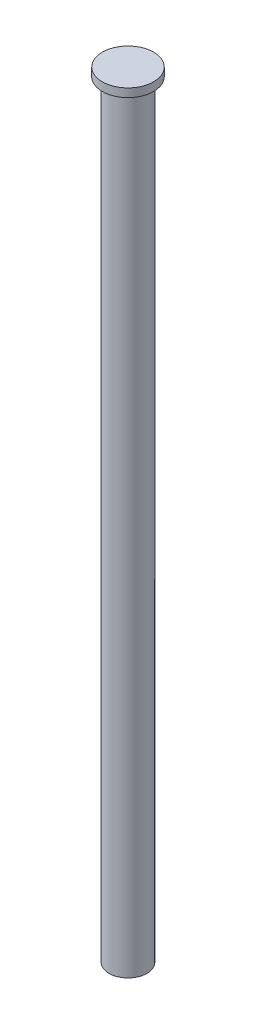
ISO-10303-21;
HEADER;
FILE_DESCRIPTION(('STEP AP214'),'2;1');
FILE_NAME('part.step','',(''),(''),'','','');
FILE_SCHEMA(('AUTOMOTIVE_DESIGN { 1 0 10303 214 1 1 1 1 }'));
ENDSEC;
DATA;
#1=APPLICATION_CONTEXT('core data for automotive mechanical design processes');
#2=APPLICATION_PROTOCOL_DEFINITION('international standard','automotive_design',2000,#1);
#3=PRODUCT_CONTEXT('',#1,'mechanical');
#4=PRODUCT('Part','Part','',(#3));
#5=PRODUCT_RELATED_PRODUCT_CATEGORY('part','',(#4));
#6=PRODUCT_DEFINITION_FORMATION('','',#4);
#7=PRODUCT_DEFINITION_CONTEXT('part definition',#1,'design');
#8=PRODUCT_DEFINITION('design','',#6,#7);
#9=PRODUCT_DEFINITION_SHAPE('','',#8);
#10=(LENGTH_UNIT() NAMED_UNIT(*) SI_UNIT(.MILLI.,.METRE.));
#11=(NAMED_UNIT(*) PLANE_ANGLE_UNIT() SI_UNIT($,.RADIAN.));
#12=(NAMED_UNIT(*) SI_UNIT($,.STERADIAN.) SOLID_ANGLE_UNIT());
#13=UNCERTAINTY_MEASURE_WITH_UNIT(LENGTH_MEASURE(1.E-05),#10,'distance_accuracy_value','');
#14=(GEOMETRIC_REPRESENTATION_CONTEXT(3) GLOBAL_UNCERTAINTY_ASSIGNED_CONTEXT((#13)) GLOBAL_UNIT_ASSIGNED_CONTEXT((#10,
#11,#12)) REPRESENTATION_CONTEXT('',''));
#15=CARTESIAN_POINT('',(0.,0.,0.));
#16=DIRECTION('',(0.,0.,1.));
#17=DIRECTION('',(1.,0.,0.));
#18=AXIS2_PLACEMENT_3D('',#15,#16,#17);
#19=CARTESIAN_POINT('',(0.,910.,0.));
#20=DIRECTION('',(0.,-1.,0.));
#21=DIRECTION('',(0.,0.,-1.));
#22=AXIS2_PLACEMENT_3D('',#19,#20,#21);
#23=CYLINDRICAL_SURFACE('',#22,22.5);
#24=CARTESIAN_POINT('',(0.,910.,0.));
#25=DIRECTION('',(0.,1.,0.));
#26=DIRECTION('',(0.,0.,1.));
#27=AXIS2_PLACEMENT_3D('',#24,#25,#26);
#28=CIRCLE('',#27,22.5);
#29=CARTESIAN_POINT('',(0.,910.,-22.5));
#30=VERTEX_POINT('',#29);
#31=EDGE_CURVE('E10',#30,#30,#28,.T.);
#32=CARTESIAN_POINT('',(0.,0.,0.));
#33=DIRECTION('',(0.,1.,0.));
#34=DIRECTION('',(0.,0.,1.));
#35=AXIS2_PLACEMENT_3D('',#32,#33,#34);
#36=CIRCLE('',#35,22.5);
#37=CARTESIAN_POINT('',(0.,0.,-22.5));
#38=VERTEX_POINT('',#37);
#39=EDGE_CURVE('E40',#38,#38,#36,.T.);
#40=CARTESIAN_POINT('',(0.,910.,-22.5));
#41=CARTESIAN_POINT('',(0.,900.520833333333,-22.5));
#42=CARTESIAN_POINT('',(0.,891.041666666667,-22.5));
#43=CARTESIAN_POINT('',(0.,872.083333333333,-22.5));
#44=CARTESIAN_POINT('',(0.,862.604166666667,-22.5));
#45=CARTESIAN_POINT('',(0.,843.645833333333,-22.5));
#46=CARTESIAN_POINT('',(0.,834.166666666667,-22.5));
#47=CARTESIAN_POINT('',(0.,815.208333333333,-22.5));
#48=CARTESIAN_POINT('',(0.,805.729166666667,-22.5));
#49=CARTESIAN_POINT('',(0.,786.770833333333,-22.5));
#50=CARTESIAN_POINT('',(0.,777.291666666667,-22.5));
#51=CARTESIAN_POINT('',(0.,758.333333333333,-22.5));
#52=CARTESIAN_POINT('',(0.,748.854166666667,-22.5));
#53=CARTESIAN_POINT('',(0.,729.895833333333,-22.5));
#54=CARTESIAN_POINT('',(0.,720.416666666667,-22.5));
#55=CARTESIAN_POINT('',(0.,701.458333333333,-22.5));
#56=CARTESIAN_POINT('',(0.,691.979166666667,-22.5));
#57=CARTESIAN_POINT('',(0.,673.020833333333,-22.5));
#58=CARTESIAN_POINT('',(0.,663.541666666667,-22.5));
#59=CARTESIAN_POINT('',(0.,644.583333333333,-22.5));
#60=CARTESIAN_POINT('',(0.,635.104166666667,-22.5));
#61=CARTESIAN_POINT('',(0.,616.145833333333,-22.5));
#62=CARTESIAN_POINT('',(0.,606.666666666667,-22.5));
#63=CARTESIAN_POINT('',(0.,587.708333333333,-22.5));
#64=CARTESIAN_POINT('',(0.,578.229166666667,-22.5));
#65=CARTESIAN_POINT('',(0.,559.270833333333,-22.5));
#66=CARTESIAN_POINT('',(0.,549.791666666667,-22.5));
#67=CARTESIAN_POINT('',(0.,530.833333333333,-22.5));
#68=CARTESIAN_POINT('',(0.,521.354166666667,-22.5));
#69=CARTESIAN_POINT('',(0.,502.395833333333,-22.5));
#70=CARTESIAN_POINT('',(0.,492.916666666667,-22.5));
#71=CARTESIAN_POINT('',(0.,473.958333333333,-22.5));
#72=CARTESIAN_POINT('',(0.,464.479166666667,-22.5));
#73=CARTESIAN_POINT('',(0.,445.520833333333,-22.5));
#74=CARTESIAN_POINT('',(0.,436.041666666667,-22.5));
#75=CARTESIAN_POINT('',(0.,417.083333333333,-22.5));
#76=CARTESIAN_POINT('',(0.,407.604166666667,-22.5));
#77=CARTESIAN_POINT('',(0.,388.645833333333,-22.5));
#78=CARTESIAN_POINT('',(0.,379.166666666667,-22.5));
#79=CARTESIAN_POINT('',(0.,360.208333333333,-22.5));
#80=CARTESIAN_POINT('',(0.,350.729166666667,-22.5));
#81=CARTESIAN_POINT('',(0.,331.770833333333,-22.5));
#82=CARTESIAN_POINT('',(0.,322.291666666667,-22.5));
#83=CARTESIAN_POINT('',(0.,303.333333333333,-22.5));
#84=CARTESIAN_POINT('',(0.,293.854166666667,-22.5));
#85=CARTESIAN_POINT('',(0.,274.895833333333,-22.5));
#86=CARTESIAN_POINT('',(0.,265.416666666667,-22.5));
#87=CARTESIAN_POINT('',(0.,246.458333333333,-22.5));
#88=CARTESIAN_POINT('',(0.,236.979166666667,-22.5));
#89=CARTESIAN_POINT('',(0.,218.020833333333,-22.5));
#90=CARTESIAN_POINT('',(0.,208.541666666667,-22.5));
#91=CARTESIAN_POINT('',(0.,189.583333333333,-22.5));
#92=CARTESIAN_POINT('',(0.,180.104166666667,-22.5));
#93=CARTESIAN_POINT('',(0.,161.145833333333,-22.5));
#94=CARTESIAN_POINT('',(0.,151.666666666667,-22.5));
#95=CARTESIAN_POINT('',(0.,132.708333333333,-22.5));
#96=CARTESIAN_POINT('',(0.,123.229166666667,-22.5));
#97=CARTESIAN_POINT('',(0.,104.270833333333,-22.5));
#98=CARTESIAN_POINT('',(0.,94.7916666666667,-22.5));
#99=CARTESIAN_POINT('',(0.,75.8333333333333,-22.5));
#100=CARTESIAN_POINT('',(0.,66.3541666666667,-22.5));
#101=CARTESIAN_POINT('',(0.,47.3958333333333,-22.5));
#102=CARTESIAN_POINT('',(0.,37.9166666666667,-22.5));
#103=CARTESIAN_POINT('',(0.,18.9583333333333,-22.5));
#104=CARTESIAN_POINT('',(0.,9.47916666666667,-22.5));
#105=CARTESIAN_POINT('',(0.,0.,-22.5));
#106=B_SPLINE_CURVE_WITH_KNOTS('',3,(#40,#41,#42,#43,#44,#45,#46,#47,#48,#49,#50,#51,#52,#53,
#54,#55,#56,#57,#58,#59,#60,#61,#62,#63,#64,#65,#66,#67,#68,#69,#70,#71,#72,#73,#74,#75,#76,#77,
#78,#79,#80,#81,#82,#83,#84,#85,#86,#87,#88,#89,#90,#91,#92,#93,#94,#95,#96,#97,#98,#99,#100,
#101,#102,#103,#104,#105),.UNSPECIFIED.,.F.,.F.,(4,2,2,2,2,2,2,2,2,2,2,2,2,2,2,2,2,2,2,2,2,2,2,
2,2,2,2,2,2,2,2,2,4),(0.,28.4375,56.875,85.3125,113.75,142.1875,170.625,199.0625,227.5,255.9375,
284.375,312.8125,341.25,369.6875,398.125,426.5625,455.,483.4375,511.875,540.3125,568.75,
597.1875,625.625,654.0625,682.5,710.9375,739.375,767.8125,796.25,824.6875,853.125,881.5625,
910.),.UNSPECIFIED.);
#107=EDGE_CURVE('BSEAM37',#30,#38,#106,.T.);
#108=ORIENTED_EDGE('',*,*,#31,.F.);
#109=ORIENTED_EDGE('',*,*,#39,.T.);
#110=ORIENTED_EDGE('',*,*,#107,.T.);
#111=ORIENTED_EDGE('',*,*,#107,.F.);
#112=EDGE_LOOP('',(#108,#110,#109,#111));
#113=FACE_BOUND('',#112,.T.);
#114=ADVANCED_FACE('F37',(#113),#23,.T.);
#115=CARTESIAN_POINT('',(0.,0.,0.));
#116=DIRECTION('',(0.,1.,0.));
#117=DIRECTION('',(0.,0.,1.));
#118=AXIS2_PLACEMENT_3D('',#115,#116,#117);
#119=PLANE('',#118);
#120=ORIENTED_EDGE('',*,*,#39,.F.);
#121=EDGE_LOOP('',(#120));
#122=FACE_BOUND('',#121,.T.);
#123=ADVANCED_FACE('F64',(#122),#119,.F.);
#124=CARTESIAN_POINT('',(0.,920.,0.));
#125=DIRECTION('',(0.,-1.,0.));
#126=DIRECTION('',(0.,0.,-1.));
#127=AXIS2_PLACEMENT_3D('',#124,#125,#126);
#128=CYLINDRICAL_SURFACE('',#127,30.4498097990453);
#129=CARTESIAN_POINT('',(0.,920.,0.));
#130=DIRECTION('',(0.,1.,0.));
#131=DIRECTION('',(0.,0.,1.));
#132=AXIS2_PLACEMENT_3D('',#129,#130,#131);
#133=CIRCLE('',#132,30.4498097990453);
#134=CARTESIAN_POINT('',(0.,920.,30.4498097990453));
#135=VERTEX_POINT('',#134);
#136=EDGE_CURVE('E49',#135,#135,#133,.T.);
#137=ORIENTED_EDGE('',*,*,#136,.F.);
#138=EDGE_LOOP('',(#137));
#139=FACE_BOUND('',#138,.T.);
#140=CARTESIAN_POINT('',(0.,910.,0.));
#141=DIRECTION('',(0.,1.,0.));
#142=DIRECTION('',(0.,0.,1.));
#143=AXIS2_PLACEMENT_3D('',#140,#141,#142);
#144=CIRCLE('',#143,30.4498097990453);
#145=CARTESIAN_POINT('',(0.,910.,30.4498097990453));
#146=VERTEX_POINT('',#145);
#147=EDGE_CURVE('E51',#146,#146,#144,.T.);
#148=ORIENTED_EDGE('',*,*,#147,.T.);
#149=EDGE_LOOP('',(#148));
#150=FACE_BOUND('',#149,.T.);
#151=ADVANCED_FACE('F61',(#139,#150),#128,.T.);
#152=CARTESIAN_POINT('',(0.,920.,0.));
#153=DIRECTION('',(0.,1.,0.));
#154=DIRECTION('',(0.,0.,1.));
#155=AXIS2_PLACEMENT_3D('',#152,#153,#154);
#156=PLANE('',#155);
#157=ORIENTED_EDGE('',*,*,#136,.T.);
#158=EDGE_LOOP('',(#157));
#159=FACE_BOUND('',#158,.T.);
#160=ADVANCED_FACE('F59',(#159),#156,.T.);
#161=CARTESIAN_POINT('',(0.,910.,0.));
#162=DIRECTION('',(0.,1.,0.));
#163=DIRECTION('',(0.,0.,1.));
#164=AXIS2_PLACEMENT_3D('',#161,#162,#163);
#165=PLANE('',#164);
#166=ORIENTED_EDGE('',*,*,#31,.T.);
#167=EDGE_LOOP('',(#166));
#168=FACE_BOUND('',#167,.T.);
#169=ORIENTED_EDGE('',*,*,#147,.F.);
#170=EDGE_LOOP('',(#169));
#171=FACE_BOUND('',#170,.T.);
#172=ADVANCED_FACE('F68',(#168,#171),#165,.F.);
#173=CLOSED_SHELL('',(#114,#123,#151,#160,#172));
#174=MANIFOLD_SOLID_BREP('B2',#173);
#175=ADVANCED_BREP_SHAPE_REPRESENTATION('',(#18,#174),#14);
#176=SHAPE_DEFINITION_REPRESENTATION(#9,#175);
ENDSEC;
END-ISO-10303-21;
